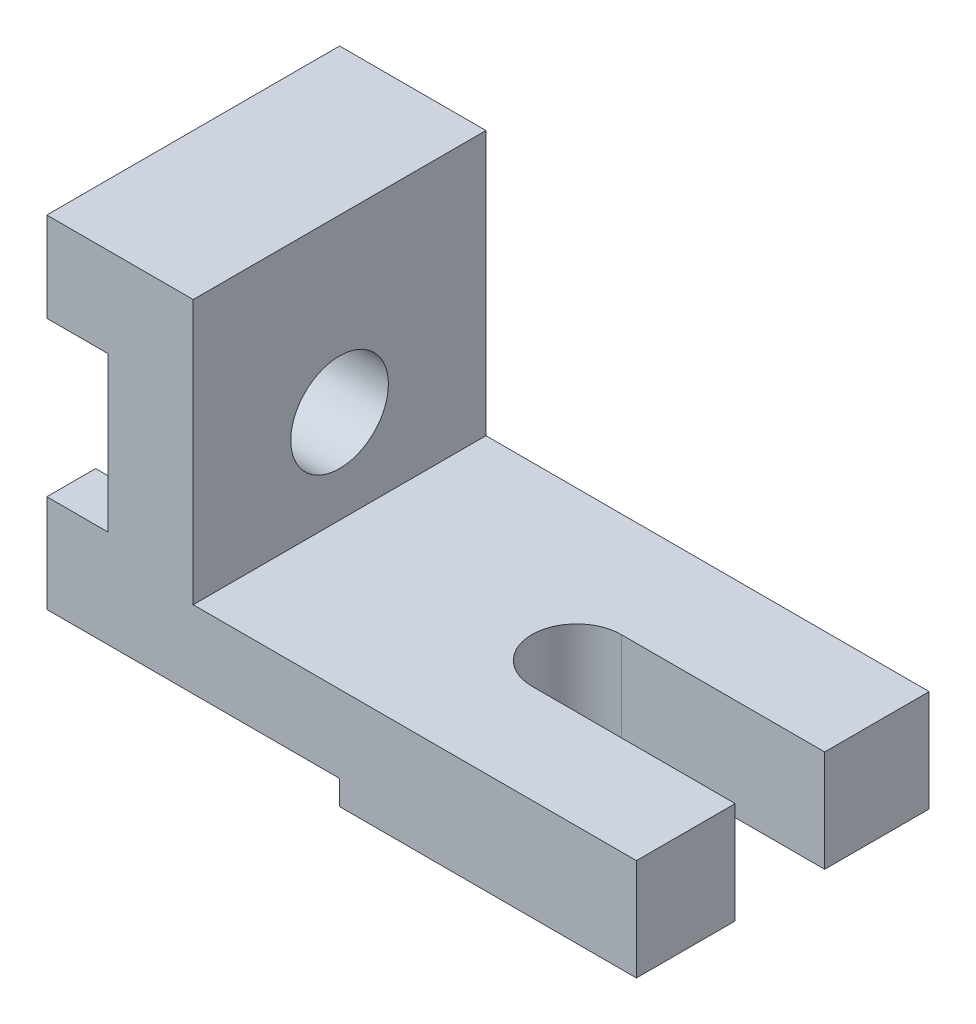
ISO-10303-21;
HEADER;
FILE_DESCRIPTION(('STEP AP214'),'2;1');
FILE_NAME('part.step','',(''),(''),'','','');
FILE_SCHEMA(('AUTOMOTIVE_DESIGN { 1 0 10303 214 1 1 1 1 }'));
ENDSEC;
DATA;
#1=APPLICATION_CONTEXT('core data for automotive mechanical design processes');
#2=APPLICATION_PROTOCOL_DEFINITION('international standard','automotive_design',2000,#1);
#3=PRODUCT_CONTEXT('',#1,'mechanical');
#4=PRODUCT('Part','Part','',(#3));
#5=PRODUCT_RELATED_PRODUCT_CATEGORY('part','',(#4));
#6=PRODUCT_DEFINITION_FORMATION('','',#4);
#7=PRODUCT_DEFINITION_CONTEXT('part definition',#1,'design');
#8=PRODUCT_DEFINITION('design','',#6,#7);
#9=PRODUCT_DEFINITION_SHAPE('','',#8);
#10=(LENGTH_UNIT() NAMED_UNIT(*) SI_UNIT(.MILLI.,.METRE.));
#11=(NAMED_UNIT(*) PLANE_ANGLE_UNIT() SI_UNIT($,.RADIAN.));
#12=(NAMED_UNIT(*) SI_UNIT($,.STERADIAN.) SOLID_ANGLE_UNIT());
#13=UNCERTAINTY_MEASURE_WITH_UNIT(LENGTH_MEASURE(1.E-05),#10,'distance_accuracy_value','');
#14=(GEOMETRIC_REPRESENTATION_CONTEXT(3) GLOBAL_UNCERTAINTY_ASSIGNED_CONTEXT((#13)) GLOBAL_UNIT_ASSIGNED_CONTEXT((#10,
#11,#12)) REPRESENTATION_CONTEXT('',''));
#15=CARTESIAN_POINT('',(0.,0.,0.));
#16=DIRECTION('',(0.,0.,1.));
#17=DIRECTION('',(1.,0.,0.));
#18=AXIS2_PLACEMENT_3D('',#15,#16,#17);
#19=CARTESIAN_POINT('',(-72.5,25.,-36.));
#20=DIRECTION('',(1.,0.,0.));
#21=DIRECTION('',(0.,0.,-1.));
#22=AXIS2_PLACEMENT_3D('',#19,#20,#21);
#23=PLANE('',#22);
#24=DIRECTION('',(0.,-1.,0.));
#25=VECTOR('',#24,1.);
#26=CARTESIAN_POINT('',(-72.5,25.,-36.));
#27=LINE('',#26,#25);
#28=CARTESIAN_POINT('',(-72.5,90.,-36.));
#29=VERTEX_POINT('',#28);
#30=CARTESIAN_POINT('',(-72.5,68.,-36.));
#31=VERTEX_POINT('',#30);
#32=EDGE_CURVE('E202',#29,#31,#27,.T.);
#33=ORIENTED_EDGE('',*,*,#32,.T.);
#34=DIRECTION('',(0.,0.,1.));
#35=VECTOR('',#34,1.);
#36=CARTESIAN_POINT('',(-72.5,68.,-36.));
#37=LINE('',#36,#35);
#38=CARTESIAN_POINT('',(-72.5,68.,-22.3606797749979));
#39=VERTEX_POINT('',#38);
#40=EDGE_CURVE('E366',#31,#39,#37,.T.);
#41=ORIENTED_EDGE('',*,*,#40,.T.);
#42=CARTESIAN_POINT('',(-72.5,48.,0.));
#43=DIRECTION('',(-1.,0.,0.));
#44=DIRECTION('',(0.,0.,1.));
#45=AXIS2_PLACEMENT_3D('',#42,#43,#44);
#46=CIRCLE('',#45,30.);
#47=CARTESIAN_POINT('',(-72.5,68.,22.3606797749979));
#48=VERTEX_POINT('',#47);
#49=EDGE_CURVE('E345',#48,#39,#46,.T.);
#50=ORIENTED_EDGE('',*,*,#49,.F.);
#51=CARTESIAN_POINT('',(-72.5,68.,36.));
#52=VERTEX_POINT('',#51);
#53=EDGE_CURVE('E372',#48,#52,#37,.T.);
#54=ORIENTED_EDGE('',*,*,#53,.T.);
#55=DIRECTION('',(0.,-1.,0.));
#56=VECTOR('',#55,1.);
#57=CARTESIAN_POINT('',(-72.5,25.,36.));
#58=LINE('',#57,#56);
#59=CARTESIAN_POINT('',(-72.5,90.,36.));
#60=VERTEX_POINT('',#59);
#61=EDGE_CURVE('E203',#60,#52,#58,.T.);
#62=ORIENTED_EDGE('',*,*,#61,.F.);
#63=DIRECTION('',(0.,0.,1.));
#64=VECTOR('',#63,1.);
#65=CARTESIAN_POINT('',(-72.5,90.,-110.30343195304));
#66=LINE('',#65,#64);
#67=EDGE_CURVE('E323',#29,#60,#66,.T.);
#68=ORIENTED_EDGE('',*,*,#67,.F.);
#69=EDGE_LOOP('',(#33,#41,#50,#54,#62,#68));
#70=FACE_BOUND('',#69,.T.);
#71=ADVANCED_FACE('F33',(#70),#23,.F.);
#72=CARTESIAN_POINT('',(-57.5,48.,0.));
#73=DIRECTION('',(-1.,0.,0.));
#74=DIRECTION('',(0.,0.,1.));
#75=AXIS2_PLACEMENT_3D('',#72,#73,#74);
#76=CYLINDRICAL_SURFACE('',#75,30.);
#77=ORIENTED_EDGE('',*,*,#49,.T.);
#78=DIRECTION('',(-1.,0.,0.));
#79=VECTOR('',#78,1.);
#80=CARTESIAN_POINT('',(-57.5,68.,-22.3606797749979));
#81=LINE('',#80,#79);
#82=CARTESIAN_POINT('',(-57.5,68.,-22.3606797749979));
#83=VERTEX_POINT('',#82);
#84=EDGE_CURVE('E357',#39,#83,#81,.F.);
#85=ORIENTED_EDGE('',*,*,#84,.T.);
#86=CARTESIAN_POINT('',(-57.5,48.,0.));
#87=DIRECTION('',(-1.,0.,0.));
#88=DIRECTION('',(0.,0.,1.));
#89=AXIS2_PLACEMENT_3D('',#86,#87,#88);
#90=CIRCLE('',#89,30.);
#91=CARTESIAN_POINT('',(-57.5,68.,22.3606797749979));
#92=VERTEX_POINT('',#91);
#93=EDGE_CURVE('E348',#92,#83,#90,.T.);
#94=ORIENTED_EDGE('',*,*,#93,.F.);
#95=DIRECTION('',(-1.,0.,0.));
#96=VECTOR('',#95,1.);
#97=CARTESIAN_POINT('',(-57.5,68.,22.3606797749979));
#98=LINE('',#97,#96);
#99=EDGE_CURVE('E360',#92,#48,#98,.T.);
#100=ORIENTED_EDGE('',*,*,#99,.T.);
#101=EDGE_LOOP('',(#77,#85,#94,#100));
#102=FACE_BOUND('',#101,.T.);
#103=ADVANCED_FACE('F404',(#102),#76,.F.);
#104=CARTESIAN_POINT('',(0.,25.,0.));
#105=DIRECTION('',(0.,1.,0.));
#106=DIRECTION('',(0.,0.,1.));
#107=AXIS2_PLACEMENT_3D('',#104,#105,#106);
#108=PLANE('',#107);
#109=DIRECTION('',(-1.,0.,0.));
#110=VECTOR('',#109,1.);
#111=CARTESIAN_POINT('',(-72.5,25.,-36.));
#112=LINE('',#111,#110);
#113=CARTESIAN_POINT('',(72.5,25.,-36.));
#114=VERTEX_POINT('',#113);
#115=CARTESIAN_POINT('',(-36.5,25.,-36.));
#116=VERTEX_POINT('',#115);
#117=EDGE_CURVE('E273',#114,#116,#112,.T.);
#118=ORIENTED_EDGE('',*,*,#117,.T.);
#119=DIRECTION('',(0.,0.,1.));
#120=VECTOR('',#119,1.);
#121=CARTESIAN_POINT('',(-36.5,25.,-110.30343195304));
#122=LINE('',#121,#120);
#123=CARTESIAN_POINT('',(-36.5,25.,36.));
#124=VERTEX_POINT('',#123);
#125=EDGE_CURVE('E316',#116,#124,#122,.T.);
#126=ORIENTED_EDGE('',*,*,#125,.T.);
#127=DIRECTION('',(1.,0.,0.));
#128=VECTOR('',#127,1.);
#129=CARTESIAN_POINT('',(-72.5,25.,36.));
#130=LINE('',#129,#128);
#131=CARTESIAN_POINT('',(72.5,25.,36.));
#132=VERTEX_POINT('',#131);
#133=EDGE_CURVE('E277',#124,#132,#130,.T.);
#134=ORIENTED_EDGE('',*,*,#133,.T.);
#135=DIRECTION('',(0.,0.,-1.));
#136=VECTOR('',#135,1.);
#137=CARTESIAN_POINT('',(72.5,25.,-36.));
#138=LINE('',#137,#136);
#139=CARTESIAN_POINT('',(72.5,25.,11.7078646640973));
#140=VERTEX_POINT('',#139);
#141=EDGE_CURVE('E270',#132,#140,#138,.T.);
#142=ORIENTED_EDGE('',*,*,#141,.T.);
#143=DIRECTION('',(1.,0.,0.));
#144=VECTOR('',#143,1.);
#145=CARTESIAN_POINT('',(22.5,25.,11.7078646640973));
#146=LINE('',#145,#144);
#147=CARTESIAN_POINT('',(22.5,25.,11.7078646640973));
#148=VERTEX_POINT('',#147);
#149=EDGE_CURVE('E313',#148,#140,#146,.T.);
#150=ORIENTED_EDGE('',*,*,#149,.F.);
#151=CARTESIAN_POINT('',(22.5,25.,0.707864664097339));
#152=DIRECTION('',(0.,1.,0.));
#153=DIRECTION('',(0.,0.,1.));
#154=AXIS2_PLACEMENT_3D('',#151,#152,#153);
#155=CIRCLE('',#154,11.);
#156=CARTESIAN_POINT('',(22.5,25.,-10.2921353359027));
#157=VERTEX_POINT('',#156);
#158=EDGE_CURVE('E330',#157,#148,#155,.T.);
#159=ORIENTED_EDGE('',*,*,#158,.F.);
#160=DIRECTION('',(-1.,0.,0.));
#161=VECTOR('',#160,1.);
#162=CARTESIAN_POINT('',(22.5,25.,-10.2921353359027));
#163=LINE('',#162,#161);
#164=CARTESIAN_POINT('',(72.5,25.,-10.2921353359027));
#165=VERTEX_POINT('',#164);
#166=EDGE_CURVE('E233',#165,#157,#163,.T.);
#167=ORIENTED_EDGE('',*,*,#166,.F.);
#168=EDGE_CURVE('E274',#165,#114,#138,.T.);
#169=ORIENTED_EDGE('',*,*,#168,.T.);
#170=EDGE_LOOP('',(#118,#126,#134,#142,#150,#159,#167,#169));
#171=FACE_BOUND('',#170,.T.);
#172=ADVANCED_FACE('F312',(#171),#108,.T.);
#173=CARTESIAN_POINT('',(72.5,25.,-36.));
#174=DIRECTION('',(-1.,0.,0.));
#175=DIRECTION('',(0.,0.,1.));
#176=AXIS2_PLACEMENT_3D('',#173,#174,#175);
#177=PLANE('',#176);
#178=ORIENTED_EDGE('',*,*,#168,.F.);
#179=DIRECTION('',(0.,1.,0.));
#180=VECTOR('',#179,1.);
#181=CARTESIAN_POINT('',(72.5,-25.,-10.2921353359027));
#182=LINE('',#181,#180);
#183=CARTESIAN_POINT('',(72.5,0.,-10.2921353359027));
#184=VERTEX_POINT('',#183);
#185=EDGE_CURVE('E236',#184,#165,#182,.T.);
#186=ORIENTED_EDGE('',*,*,#185,.F.);
#187=DIRECTION('',(0.,0.,-1.));
#188=VECTOR('',#187,1.);
#189=CARTESIAN_POINT('',(72.5,0.,-36.));
#190=LINE('',#189,#188);
#191=CARTESIAN_POINT('',(72.5,0.,-36.));
#192=VERTEX_POINT('',#191);
#193=EDGE_CURVE('E266',#184,#192,#190,.T.);
#194=ORIENTED_EDGE('',*,*,#193,.T.);
#195=DIRECTION('',(0.,-1.,0.));
#196=VECTOR('',#195,1.);
#197=CARTESIAN_POINT('',(72.5,25.,-36.));
#198=LINE('',#197,#196);
#199=EDGE_CURVE('E206',#114,#192,#198,.T.);
#200=ORIENTED_EDGE('',*,*,#199,.F.);
#201=EDGE_LOOP('',(#178,#186,#194,#200));
#202=FACE_BOUND('',#201,.T.);
#203=ADVANCED_FACE('F337',(#202),#177,.F.);
#204=CARTESIAN_POINT('',(72.5,0.,36.));
#205=VERTEX_POINT('',#204);
#206=CARTESIAN_POINT('',(72.5,0.,11.7078646640973));
#207=VERTEX_POINT('',#206);
#208=EDGE_CURVE('E280',#205,#207,#190,.T.);
#209=ORIENTED_EDGE('',*,*,#208,.T.);
#210=DIRECTION('',(0.,1.,0.));
#211=VECTOR('',#210,1.);
#212=CARTESIAN_POINT('',(72.5,-25.,11.7078646640973));
#213=LINE('',#212,#211);
#214=EDGE_CURVE('E241',#207,#140,#213,.T.);
#215=ORIENTED_EDGE('',*,*,#214,.T.);
#216=ORIENTED_EDGE('',*,*,#141,.F.);
#217=DIRECTION('',(0.,-1.,0.));
#218=VECTOR('',#217,1.);
#219=CARTESIAN_POINT('',(72.5,25.,36.));
#220=LINE('',#219,#218);
#221=EDGE_CURVE('E279',#132,#205,#220,.T.);
#222=ORIENTED_EDGE('',*,*,#221,.T.);
#223=EDGE_LOOP('',(#209,#215,#216,#222));
#224=FACE_BOUND('',#223,.T.);
#225=ADVANCED_FACE('F35',(#224),#177,.F.);
#226=CARTESIAN_POINT('',(-72.5,25.,-36.));
#227=DIRECTION('',(0.,0.,1.));
#228=DIRECTION('',(1.,0.,0.));
#229=AXIS2_PLACEMENT_3D('',#226,#227,#228);
#230=PLANE('',#229);
#231=DIRECTION('',(0.,1.,0.));
#232=VECTOR('',#231,1.);
#233=CARTESIAN_POINT('',(-57.5,68.,-36.));
#234=LINE('',#233,#232);
#235=CARTESIAN_POINT('',(-57.5,30.,-36.));
#236=VERTEX_POINT('',#235);
#237=CARTESIAN_POINT('',(-57.5,68.,-36.));
#238=VERTEX_POINT('',#237);
#239=EDGE_CURVE('E182',#236,#238,#234,.T.);
#240=ORIENTED_EDGE('',*,*,#239,.T.);
#241=DIRECTION('',(-1.,0.,0.));
#242=VECTOR('',#241,1.);
#243=CARTESIAN_POINT('',(-72.5,68.,-36.));
#244=LINE('',#243,#242);
#245=EDGE_CURVE('E381',#238,#31,#244,.T.);
#246=ORIENTED_EDGE('',*,*,#245,.T.);
#247=ORIENTED_EDGE('',*,*,#32,.F.);
#248=DIRECTION('',(1.,0.,0.));
#249=VECTOR('',#248,1.);
#250=CARTESIAN_POINT('',(-36.5,90.,-36.));
#251=LINE('',#250,#249);
#252=CARTESIAN_POINT('',(-36.5,90.,-36.));
#253=VERTEX_POINT('',#252);
#254=EDGE_CURVE('E331',#29,#253,#251,.T.);
#255=ORIENTED_EDGE('',*,*,#254,.T.);
#256=DIRECTION('',(0.,-1.,0.));
#257=VECTOR('',#256,1.);
#258=CARTESIAN_POINT('',(-36.5,25.,-36.));
#259=LINE('',#258,#257);
#260=EDGE_CURVE('E338',#253,#116,#259,.T.);
#261=ORIENTED_EDGE('',*,*,#260,.T.);
#262=ORIENTED_EDGE('',*,*,#117,.F.);
#263=ORIENTED_EDGE('',*,*,#199,.T.);
#264=DIRECTION('',(-1.,0.,0.));
#265=VECTOR('',#264,1.);
#266=CARTESIAN_POINT('',(-72.5,0.,-36.));
#267=LINE('',#266,#265);
#268=CARTESIAN_POINT('',(-72.5,0.,-36.));
#269=VERTEX_POINT('',#268);
#270=EDGE_CURVE('E200',#192,#269,#267,.T.);
#271=ORIENTED_EDGE('',*,*,#270,.T.);
#272=CARTESIAN_POINT('',(-72.5,30.,-36.));
#273=VERTEX_POINT('',#272);
#274=EDGE_CURVE('E190',#273,#269,#27,.T.);
#275=ORIENTED_EDGE('',*,*,#274,.F.);
#276=DIRECTION('',(1.,0.,0.));
#277=VECTOR('',#276,1.);
#278=CARTESIAN_POINT('',(-57.5,30.,-36.));
#279=LINE('',#278,#277);
#280=EDGE_CURVE('E174',#273,#236,#279,.T.);
#281=ORIENTED_EDGE('',*,*,#280,.T.);
#282=EDGE_LOOP('',(#240,#246,#247,#255,#261,#262,#263,#271,#275,#281));
#283=FACE_BOUND('',#282,.T.);
#284=ADVANCED_FACE('F197',(#283),#230,.F.);
#285=CARTESIAN_POINT('',(-72.5,30.,36.));
#286=VERTEX_POINT('',#285);
#287=CARTESIAN_POINT('',(-72.5,6.,36.));
#288=VERTEX_POINT('',#287);
#289=EDGE_CURVE('E208',#286,#288,#58,.T.);
#290=ORIENTED_EDGE('',*,*,#289,.F.);
#291=DIRECTION('',(0.,0.,1.));
#292=VECTOR('',#291,1.);
#293=CARTESIAN_POINT('',(-72.5,30.,-36.));
#294=LINE('',#293,#292);
#295=CARTESIAN_POINT('',(-72.5,30.,24.));
#296=VERTEX_POINT('',#295);
#297=EDGE_CURVE('E195',#296,#286,#294,.T.);
#298=ORIENTED_EDGE('',*,*,#297,.F.);
#299=CARTESIAN_POINT('',(-72.5,30.,-24.));
#300=VERTEX_POINT('',#299);
#301=EDGE_CURVE('E194',#300,#296,#46,.T.);
#302=ORIENTED_EDGE('',*,*,#301,.F.);
#303=EDGE_CURVE('E48',#273,#300,#294,.T.);
#304=ORIENTED_EDGE('',*,*,#303,.F.);
#305=ORIENTED_EDGE('',*,*,#274,.T.);
#306=DIRECTION('',(0.,0.,1.));
#307=VECTOR('',#306,1.);
#308=CARTESIAN_POINT('',(-72.5,0.,-36.));
#309=LINE('',#308,#307);
#310=CARTESIAN_POINT('',(-72.5,0.,-14.));
#311=VERTEX_POINT('',#310);
#312=EDGE_CURVE('E283',#269,#311,#309,.T.);
#313=ORIENTED_EDGE('',*,*,#312,.T.);
#314=DIRECTION('',(0.,-1.,0.));
#315=VECTOR('',#314,1.);
#316=CARTESIAN_POINT('',(-72.5,0.,-14.));
#317=LINE('',#316,#315);
#318=CARTESIAN_POINT('',(-72.5,6.,-14.));
#319=VERTEX_POINT('',#318);
#320=EDGE_CURVE('E249',#319,#311,#317,.T.);
#321=ORIENTED_EDGE('',*,*,#320,.F.);
#322=DIRECTION('',(0.,0.,1.));
#323=VECTOR('',#322,1.);
#324=CARTESIAN_POINT('',(-72.5,6.,-14.));
#325=LINE('',#324,#323);
#326=EDGE_CURVE('E263',#319,#288,#325,.T.);
#327=ORIENTED_EDGE('',*,*,#326,.T.);
#328=EDGE_LOOP('',(#290,#298,#302,#304,#305,#313,#321,#327));
#329=FACE_BOUND('',#328,.T.);
#330=ADVANCED_FACE('F188',(#329),#23,.F.);
#331=CARTESIAN_POINT('',(-72.5,25.,36.));
#332=DIRECTION('',(0.,0.,-1.));
#333=DIRECTION('',(-1.,0.,0.));
#334=AXIS2_PLACEMENT_3D('',#331,#332,#333);
#335=PLANE('',#334);
#336=ORIENTED_EDGE('',*,*,#61,.T.);
#337=DIRECTION('',(-1.,0.,0.));
#338=VECTOR('',#337,1.);
#339=CARTESIAN_POINT('',(-72.5,68.,36.));
#340=LINE('',#339,#338);
#341=CARTESIAN_POINT('',(-57.5,68.,36.));
#342=VERTEX_POINT('',#341);
#343=EDGE_CURVE('E183',#342,#52,#340,.T.);
#344=ORIENTED_EDGE('',*,*,#343,.F.);
#345=DIRECTION('',(0.,1.,0.));
#346=VECTOR('',#345,1.);
#347=CARTESIAN_POINT('',(-57.5,68.,36.));
#348=LINE('',#347,#346);
#349=CARTESIAN_POINT('',(-57.5,30.,36.));
#350=VERTEX_POINT('',#349);
#351=EDGE_CURVE('E376',#350,#342,#348,.T.);
#352=ORIENTED_EDGE('',*,*,#351,.F.);
#353=DIRECTION('',(1.,0.,0.));
#354=VECTOR('',#353,1.);
#355=CARTESIAN_POINT('',(-57.5,30.,36.));
#356=LINE('',#355,#354);
#357=EDGE_CURVE('E296',#286,#350,#356,.T.);
#358=ORIENTED_EDGE('',*,*,#357,.F.);
#359=ORIENTED_EDGE('',*,*,#289,.T.);
#360=DIRECTION('',(-1.,0.,0.));
#361=VECTOR('',#360,1.);
#362=CARTESIAN_POINT('',(-72.5,6.,36.));
#363=LINE('',#362,#361);
#364=CARTESIAN_POINT('',(-0.499999999999987,6.,36.));
#365=VERTEX_POINT('',#364);
#366=EDGE_CURVE('E239',#365,#288,#363,.T.);
#367=ORIENTED_EDGE('',*,*,#366,.F.);
#368=DIRECTION('',(0.,1.,0.));
#369=VECTOR('',#368,1.);
#370=CARTESIAN_POINT('',(-0.499999999999987,0.,36.));
#371=LINE('',#370,#369);
#372=CARTESIAN_POINT('',(-0.499999999999987,0.,36.));
#373=VERTEX_POINT('',#372);
#374=EDGE_CURVE('E235',#373,#365,#371,.T.);
#375=ORIENTED_EDGE('',*,*,#374,.F.);
#376=DIRECTION('',(1.,0.,0.));
#377=VECTOR('',#376,1.);
#378=CARTESIAN_POINT('',(-72.5,0.,36.));
#379=LINE('',#378,#377);
#380=EDGE_CURVE('E285',#373,#205,#379,.T.);
#381=ORIENTED_EDGE('',*,*,#380,.T.);
#382=ORIENTED_EDGE('',*,*,#221,.F.);
#383=ORIENTED_EDGE('',*,*,#133,.F.);
#384=DIRECTION('',(0.,1.,0.));
#385=VECTOR('',#384,1.);
#386=CARTESIAN_POINT('',(-36.5,25.,36.));
#387=LINE('',#386,#385);
#388=CARTESIAN_POINT('',(-36.5,90.,36.));
#389=VERTEX_POINT('',#388);
#390=EDGE_CURVE('E326',#124,#389,#387,.T.);
#391=ORIENTED_EDGE('',*,*,#390,.T.);
#392=DIRECTION('',(-1.,0.,0.));
#393=VECTOR('',#392,1.);
#394=CARTESIAN_POINT('',(-36.5,90.,36.));
#395=LINE('',#394,#393);
#396=EDGE_CURVE('E321',#389,#60,#395,.T.);
#397=ORIENTED_EDGE('',*,*,#396,.T.);
#398=EDGE_LOOP('',(#336,#344,#352,#358,#359,#367,#375,#381,#382,#383,#391,#397));
#399=FACE_BOUND('',#398,.T.);
#400=ADVANCED_FACE('F293',(#399),#335,.F.);
#401=CARTESIAN_POINT('',(0.,0.,0.));
#402=DIRECTION('',(0.,1.,0.));
#403=DIRECTION('',(0.,0.,1.));
#404=AXIS2_PLACEMENT_3D('',#401,#402,#403);
#405=PLANE('',#404);
#406=ORIENTED_EDGE('',*,*,#193,.F.);
#407=DIRECTION('',(-1.,0.,0.));
#408=VECTOR('',#407,1.);
#409=CARTESIAN_POINT('',(0.,0.,-10.2921353359027));
#410=LINE('',#409,#408);
#411=CARTESIAN_POINT('',(22.5,0.,-10.2921353359027));
#412=VERTEX_POINT('',#411);
#413=EDGE_CURVE('E11',#184,#412,#410,.T.);
#414=ORIENTED_EDGE('',*,*,#413,.T.);
#415=CARTESIAN_POINT('',(22.5,0.,0.707864664097339));
#416=DIRECTION('',(0.,1.,0.));
#417=DIRECTION('',(0.,0.,1.));
#418=AXIS2_PLACEMENT_3D('',#415,#416,#417);
#419=CIRCLE('',#418,11.);
#420=CARTESIAN_POINT('',(22.5,0.,11.7078646640973));
#421=VERTEX_POINT('',#420);
#422=EDGE_CURVE('E41',#412,#421,#419,.T.);
#423=ORIENTED_EDGE('',*,*,#422,.T.);
#424=DIRECTION('',(1.,0.,0.));
#425=VECTOR('',#424,1.);
#426=CARTESIAN_POINT('',(0.,0.,11.7078646640973));
#427=LINE('',#426,#425);
#428=EDGE_CURVE('E213',#421,#207,#427,.T.);
#429=ORIENTED_EDGE('',*,*,#428,.T.);
#430=ORIENTED_EDGE('',*,*,#208,.F.);
#431=ORIENTED_EDGE('',*,*,#380,.F.);
#432=DIRECTION('',(0.,0.,1.));
#433=VECTOR('',#432,1.);
#434=CARTESIAN_POINT('',(-0.499999999999987,0.,-14.));
#435=LINE('',#434,#433);
#436=CARTESIAN_POINT('',(-0.499999999999987,0.,-14.));
#437=VERTEX_POINT('',#436);
#438=EDGE_CURVE('E259',#437,#373,#435,.T.);
#439=ORIENTED_EDGE('',*,*,#438,.F.);
#440=DIRECTION('',(1.,0.,0.));
#441=VECTOR('',#440,1.);
#442=CARTESIAN_POINT('',(-72.5,0.,-14.));
#443=LINE('',#442,#441);
#444=EDGE_CURVE('E251',#311,#437,#443,.T.);
#445=ORIENTED_EDGE('',*,*,#444,.F.);
#446=ORIENTED_EDGE('',*,*,#312,.F.);
#447=ORIENTED_EDGE('',*,*,#270,.F.);
#448=EDGE_LOOP('',(#406,#414,#423,#429,#430,#431,#439,#445,#446,#447));
#449=FACE_BOUND('',#448,.T.);
#450=ADVANCED_FACE('F218',(#449),#405,.F.);
#451=CARTESIAN_POINT('',(-72.5,6.,-14.));
#452=DIRECTION('',(0.,1.,0.));
#453=DIRECTION('',(0.,0.,1.));
#454=AXIS2_PLACEMENT_3D('',#451,#452,#453);
#455=PLANE('',#454);
#456=ORIENTED_EDGE('',*,*,#366,.T.);
#457=ORIENTED_EDGE('',*,*,#326,.F.);
#458=DIRECTION('',(-1.,0.,0.));
#459=VECTOR('',#458,1.);
#460=CARTESIAN_POINT('',(-72.5,6.,-14.));
#461=LINE('',#460,#459);
#462=CARTESIAN_POINT('',(-0.499999999999987,6.,-14.));
#463=VERTEX_POINT('',#462);
#464=EDGE_CURVE('E257',#463,#319,#461,.T.);
#465=ORIENTED_EDGE('',*,*,#464,.F.);
#466=DIRECTION('',(0.,0.,1.));
#467=VECTOR('',#466,1.);
#468=CARTESIAN_POINT('',(-0.499999999999987,6.,-14.));
#469=LINE('',#468,#467);
#470=EDGE_CURVE('E267',#463,#365,#469,.T.);
#471=ORIENTED_EDGE('',*,*,#470,.T.);
#472=EDGE_LOOP('',(#456,#457,#465,#471));
#473=FACE_BOUND('',#472,.T.);
#474=ADVANCED_FACE('F298',(#473),#455,.F.);
#475=CARTESIAN_POINT('',(-0.499999999999987,0.,-14.));
#476=DIRECTION('',(1.,0.,0.));
#477=DIRECTION('',(0.,0.,-1.));
#478=AXIS2_PLACEMENT_3D('',#475,#476,#477);
#479=PLANE('',#478);
#480=ORIENTED_EDGE('',*,*,#374,.T.);
#481=ORIENTED_EDGE('',*,*,#470,.F.);
#482=DIRECTION('',(0.,1.,0.));
#483=VECTOR('',#482,1.);
#484=CARTESIAN_POINT('',(-0.499999999999987,0.,-14.));
#485=LINE('',#484,#483);
#486=EDGE_CURVE('E254',#437,#463,#485,.T.);
#487=ORIENTED_EDGE('',*,*,#486,.F.);
#488=ORIENTED_EDGE('',*,*,#438,.T.);
#489=EDGE_LOOP('',(#480,#481,#487,#488));
#490=FACE_BOUND('',#489,.T.);
#491=ADVANCED_FACE('F307',(#490),#479,.F.);
#492=CARTESIAN_POINT('',(0.,0.,-14.));
#493=DIRECTION('',(0.,0.,-1.));
#494=DIRECTION('',(-1.,0.,0.));
#495=AXIS2_PLACEMENT_3D('',#492,#493,#494);
#496=PLANE('',#495);
#497=ORIENTED_EDGE('',*,*,#320,.T.);
#498=ORIENTED_EDGE('',*,*,#444,.T.);
#499=ORIENTED_EDGE('',*,*,#486,.T.);
#500=ORIENTED_EDGE('',*,*,#464,.T.);
#501=EDGE_LOOP('',(#497,#498,#499,#500));
#502=FACE_BOUND('',#501,.T.);
#503=ADVANCED_FACE('F303',(#502),#496,.F.);
#504=CARTESIAN_POINT('',(22.5,-25.,0.707864664097339));
#505=DIRECTION('',(0.,1.,0.));
#506=DIRECTION('',(0.,0.,1.));
#507=AXIS2_PLACEMENT_3D('',#504,#505,#506);
#508=CYLINDRICAL_SURFACE('',#507,11.);
#509=DIRECTION('',(0.,1.,0.));
#510=VECTOR('',#509,1.);
#511=CARTESIAN_POINT('',(22.5,-25.,-10.2921353359027));
#512=LINE('',#511,#510);
#513=EDGE_CURVE('E226',#412,#157,#512,.T.);
#514=ORIENTED_EDGE('',*,*,#513,.T.);
#515=ORIENTED_EDGE('',*,*,#158,.T.);
#516=DIRECTION('',(0.,1.,0.));
#517=VECTOR('',#516,1.);
#518=CARTESIAN_POINT('',(22.5,-25.,11.7078646640973));
#519=LINE('',#518,#517);
#520=EDGE_CURVE('E228',#421,#148,#519,.T.);
#521=ORIENTED_EDGE('',*,*,#520,.F.);
#522=ORIENTED_EDGE('',*,*,#422,.F.);
#523=EDGE_LOOP('',(#514,#515,#521,#522));
#524=FACE_BOUND('',#523,.T.);
#525=ADVANCED_FACE('F224',(#524),#508,.F.);
#526=CARTESIAN_POINT('',(22.5,-25.,-10.2921353359027));
#527=DIRECTION('',(0.,0.,-1.));
#528=DIRECTION('',(-1.,0.,0.));
#529=AXIS2_PLACEMENT_3D('',#526,#527,#528);
#530=PLANE('',#529);
#531=ORIENTED_EDGE('',*,*,#185,.T.);
#532=ORIENTED_EDGE('',*,*,#166,.T.);
#533=ORIENTED_EDGE('',*,*,#513,.F.);
#534=ORIENTED_EDGE('',*,*,#413,.F.);
#535=EDGE_LOOP('',(#531,#532,#533,#534));
#536=FACE_BOUND('',#535,.T.);
#537=ADVANCED_FACE('F230',(#536),#530,.F.);
#538=CARTESIAN_POINT('',(22.5,-25.,11.7078646640973));
#539=DIRECTION('',(0.,0.,1.));
#540=DIRECTION('',(1.,0.,0.));
#541=AXIS2_PLACEMENT_3D('',#538,#539,#540);
#542=PLANE('',#541);
#543=ORIENTED_EDGE('',*,*,#520,.T.);
#544=ORIENTED_EDGE('',*,*,#149,.T.);
#545=ORIENTED_EDGE('',*,*,#214,.F.);
#546=ORIENTED_EDGE('',*,*,#428,.F.);
#547=EDGE_LOOP('',(#543,#544,#545,#546));
#548=FACE_BOUND('',#547,.T.);
#549=ADVANCED_FACE('F333',(#548),#542,.F.);
#550=CARTESIAN_POINT('',(-36.5,90.,-110.30343195304));
#551=DIRECTION('',(0.,1.,0.));
#552=DIRECTION('',(0.,0.,1.));
#553=AXIS2_PLACEMENT_3D('',#550,#551,#552);
#554=PLANE('',#553);
#555=ORIENTED_EDGE('',*,*,#254,.F.);
#556=ORIENTED_EDGE('',*,*,#67,.T.);
#557=ORIENTED_EDGE('',*,*,#396,.F.);
#558=DIRECTION('',(0.,0.,1.));
#559=VECTOR('',#558,1.);
#560=CARTESIAN_POINT('',(-36.5,90.,-110.30343195304));
#561=LINE('',#560,#559);
#562=EDGE_CURVE('E320',#253,#389,#561,.T.);
#563=ORIENTED_EDGE('',*,*,#562,.F.);
#564=EDGE_LOOP('',(#555,#556,#557,#563));
#565=FACE_BOUND('',#564,.T.);
#566=ADVANCED_FACE('F413',(#565),#554,.T.);
#567=CARTESIAN_POINT('',(-36.5,25.,-110.30343195304));
#568=DIRECTION('',(1.,0.,0.));
#569=DIRECTION('',(0.,0.,-1.));
#570=AXIS2_PLACEMENT_3D('',#567,#568,#569);
#571=PLANE('',#570);
#572=CARTESIAN_POINT('',(-36.5,48.,0.));
#573=DIRECTION('',(1.,0.,0.));
#574=DIRECTION('',(0.,0.,-1.));
#575=AXIS2_PLACEMENT_3D('',#572,#573,#574);
#576=CIRCLE('',#575,12.);
#577=CARTESIAN_POINT('',(-36.5,48.,-12.));
#578=VERTEX_POINT('',#577);
#579=EDGE_CURVE('E380',#578,#578,#576,.T.);
#580=ORIENTED_EDGE('',*,*,#579,.F.);
#581=EDGE_LOOP('',(#580));
#582=FACE_BOUND('',#581,.T.);
#583=ORIENTED_EDGE('',*,*,#260,.F.);
#584=ORIENTED_EDGE('',*,*,#562,.T.);
#585=ORIENTED_EDGE('',*,*,#390,.F.);
#586=ORIENTED_EDGE('',*,*,#125,.F.);
#587=EDGE_LOOP('',(#583,#584,#585,#586));
#588=FACE_BOUND('',#587,.T.);
#589=ADVANCED_FACE('F414',(#582,#588),#571,.T.);
#590=ORIENTED_EDGE('',*,*,#301,.T.);
#591=DIRECTION('',(-1.,0.,0.));
#592=VECTOR('',#591,1.);
#593=CARTESIAN_POINT('',(-57.5,30.,24.));
#594=LINE('',#593,#592);
#595=CARTESIAN_POINT('',(-57.5,30.,24.));
#596=VERTEX_POINT('',#595);
#597=EDGE_CURVE('E363',#296,#596,#594,.F.);
#598=ORIENTED_EDGE('',*,*,#597,.T.);
#599=CARTESIAN_POINT('',(-57.5,30.,-24.));
#600=VERTEX_POINT('',#599);
#601=EDGE_CURVE('E351',#600,#596,#90,.T.);
#602=ORIENTED_EDGE('',*,*,#601,.F.);
#603=DIRECTION('',(-1.,0.,0.));
#604=VECTOR('',#603,1.);
#605=CARTESIAN_POINT('',(-57.5,30.,-24.));
#606=LINE('',#605,#604);
#607=EDGE_CURVE('E365',#600,#300,#606,.T.);
#608=ORIENTED_EDGE('',*,*,#607,.T.);
#609=EDGE_LOOP('',(#590,#598,#602,#608));
#610=FACE_BOUND('',#609,.T.);
#611=ADVANCED_FACE('F395',(#610),#76,.F.);
#612=CARTESIAN_POINT('',(-57.5,48.,0.));
#613=DIRECTION('',(-1.,0.,0.));
#614=DIRECTION('',(0.,0.,1.));
#615=AXIS2_PLACEMENT_3D('',#612,#613,#614);
#616=PLANE('',#615);
#617=CARTESIAN_POINT('',(-57.5,48.,0.));
#618=DIRECTION('',(-1.,0.,0.));
#619=DIRECTION('',(0.,0.,1.));
#620=AXIS2_PLACEMENT_3D('',#617,#618,#619);
#621=CIRCLE('',#620,12.);
#622=CARTESIAN_POINT('',(-57.5,48.,12.));
#623=VERTEX_POINT('',#622);
#624=EDGE_CURVE('E387',#623,#623,#621,.T.);
#625=ORIENTED_EDGE('',*,*,#624,.F.);
#626=EDGE_LOOP('',(#625));
#627=FACE_BOUND('',#626,.T.);
#628=ORIENTED_EDGE('',*,*,#601,.T.);
#629=DIRECTION('',(0.,0.,1.));
#630=VECTOR('',#629,1.);
#631=CARTESIAN_POINT('',(-57.5,30.,-36.));
#632=LINE('',#631,#630);
#633=EDGE_CURVE('E56',#596,#350,#632,.T.);
#634=ORIENTED_EDGE('',*,*,#633,.T.);
#635=ORIENTED_EDGE('',*,*,#351,.T.);
#636=DIRECTION('',(0.,0.,1.));
#637=VECTOR('',#636,1.);
#638=CARTESIAN_POINT('',(-57.5,68.,-36.));
#639=LINE('',#638,#637);
#640=EDGE_CURVE('E369',#92,#342,#639,.T.);
#641=ORIENTED_EDGE('',*,*,#640,.F.);
#642=ORIENTED_EDGE('',*,*,#93,.T.);
#643=EDGE_CURVE('E370',#238,#83,#639,.T.);
#644=ORIENTED_EDGE('',*,*,#643,.F.);
#645=ORIENTED_EDGE('',*,*,#239,.F.);
#646=EDGE_CURVE('E177',#236,#600,#632,.T.);
#647=ORIENTED_EDGE('',*,*,#646,.T.);
#648=EDGE_LOOP('',(#628,#634,#635,#641,#642,#644,#645,#647));
#649=FACE_BOUND('',#648,.T.);
#650=ADVANCED_FACE('F393',(#627,#649),#616,.T.);
#651=CARTESIAN_POINT('',(-57.5,30.,-36.));
#652=DIRECTION('',(0.,-1.,0.));
#653=DIRECTION('',(0.,0.,-1.));
#654=AXIS2_PLACEMENT_3D('',#651,#652,#653);
#655=PLANE('',#654);
#656=ORIENTED_EDGE('',*,*,#646,.F.);
#657=ORIENTED_EDGE('',*,*,#280,.F.);
#658=ORIENTED_EDGE('',*,*,#303,.T.);
#659=ORIENTED_EDGE('',*,*,#607,.F.);
#660=EDGE_LOOP('',(#656,#657,#658,#659));
#661=FACE_BOUND('',#660,.T.);
#662=ADVANCED_FACE('F175',(#661),#655,.F.);
#663=CARTESIAN_POINT('',(-72.5,68.,-36.));
#664=DIRECTION('',(0.,1.,0.));
#665=DIRECTION('',(0.,0.,1.));
#666=AXIS2_PLACEMENT_3D('',#663,#664,#665);
#667=PLANE('',#666);
#668=ORIENTED_EDGE('',*,*,#40,.F.);
#669=ORIENTED_EDGE('',*,*,#245,.F.);
#670=ORIENTED_EDGE('',*,*,#643,.T.);
#671=ORIENTED_EDGE('',*,*,#84,.F.);
#672=EDGE_LOOP('',(#668,#669,#670,#671));
#673=FACE_BOUND('',#672,.T.);
#674=ADVANCED_FACE('F407',(#673),#667,.F.);
#675=ORIENTED_EDGE('',*,*,#640,.T.);
#676=ORIENTED_EDGE('',*,*,#343,.T.);
#677=ORIENTED_EDGE('',*,*,#53,.F.);
#678=ORIENTED_EDGE('',*,*,#99,.F.);
#679=EDGE_LOOP('',(#675,#676,#677,#678));
#680=FACE_BOUND('',#679,.T.);
#681=ADVANCED_FACE('F534',(#680),#667,.F.);
#682=ORIENTED_EDGE('',*,*,#297,.T.);
#683=ORIENTED_EDGE('',*,*,#357,.T.);
#684=ORIENTED_EDGE('',*,*,#633,.F.);
#685=ORIENTED_EDGE('',*,*,#597,.F.);
#686=EDGE_LOOP('',(#682,#683,#684,#685));
#687=FACE_BOUND('',#686,.T.);
#688=ADVANCED_FACE('F399',(#687),#655,.F.);
#689=CARTESIAN_POINT('',(72.5,48.,0.));
#690=DIRECTION('',(-1.,0.,0.));
#691=DIRECTION('',(0.,0.,1.));
#692=AXIS2_PLACEMENT_3D('',#689,#690,#691);
#693=CYLINDRICAL_SURFACE('',#692,12.);
#694=ORIENTED_EDGE('',*,*,#579,.T.);
#695=EDGE_LOOP('',(#694));
#696=FACE_BOUND('',#695,.T.);
#697=ORIENTED_EDGE('',*,*,#624,.T.);
#698=EDGE_LOOP('',(#697));
#699=FACE_BOUND('',#698,.T.);
#700=ADVANCED_FACE('F391',(#696,#699),#693,.F.);
#701=CLOSED_SHELL('',(#71,#103,#172,#203,#225,#284,#330,#400,#450,#474,#491,#503,#525,#537,#549,
#566,#589,#611,#650,#662,#674,#681,#688,#700));
#702=MANIFOLD_SOLID_BREP('B2',#701);
#703=ADVANCED_BREP_SHAPE_REPRESENTATION('',(#18,#702),#14);
#704=SHAPE_DEFINITION_REPRESENTATION(#9,#703);
ENDSEC;
END-ISO-10303-21;
